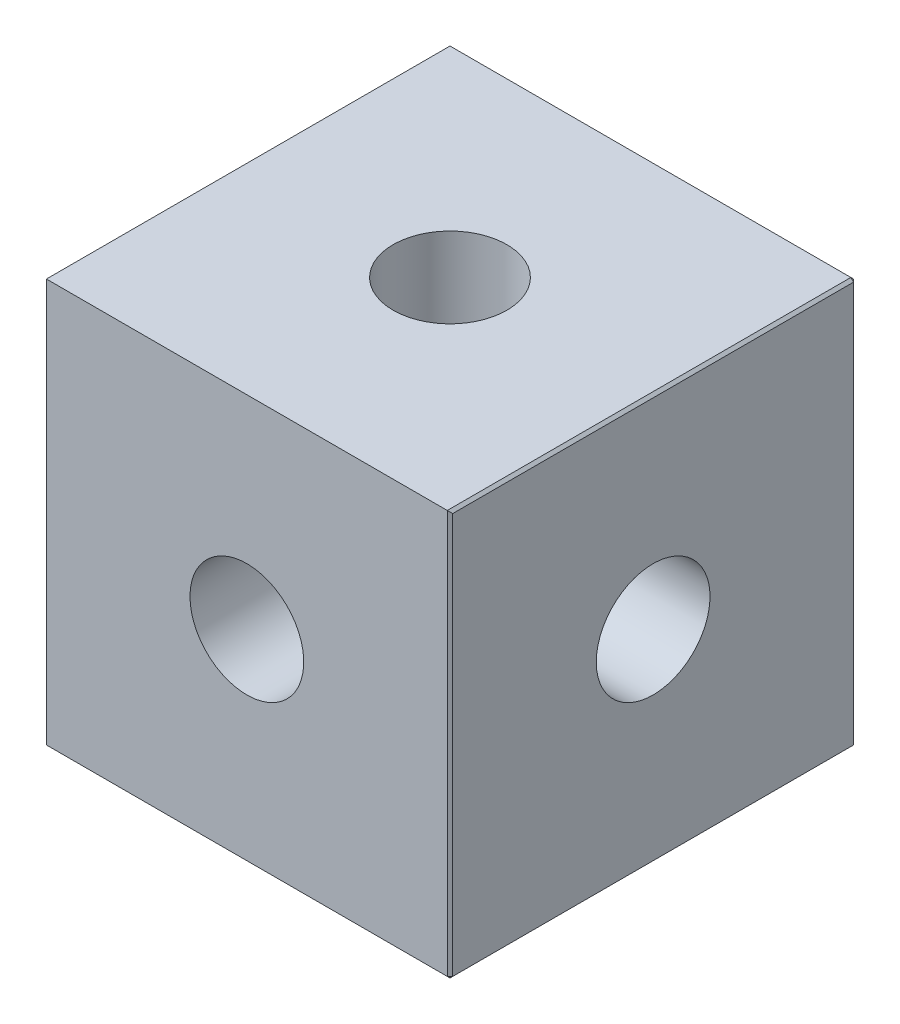
ISO-10303-21;
HEADER;
FILE_DESCRIPTION(('STEP AP214'),'2;1');
FILE_NAME('part.step','',(''),(''),'','','');
FILE_SCHEMA(('AUTOMOTIVE_DESIGN { 1 0 10303 214 1 1 1 1 }'));
ENDSEC;
DATA;
#1=APPLICATION_CONTEXT('core data for automotive mechanical design processes');
#2=APPLICATION_PROTOCOL_DEFINITION('international standard','automotive_design',2000,#1);
#3=PRODUCT_CONTEXT('',#1,'mechanical');
#4=PRODUCT('Part','Part','',(#3));
#5=PRODUCT_RELATED_PRODUCT_CATEGORY('part','',(#4));
#6=PRODUCT_DEFINITION_FORMATION('','',#4);
#7=PRODUCT_DEFINITION_CONTEXT('part definition',#1,'design');
#8=PRODUCT_DEFINITION('design','',#6,#7);
#9=PRODUCT_DEFINITION_SHAPE('','',#8);
#10=(LENGTH_UNIT() NAMED_UNIT(*) SI_UNIT(.MILLI.,.METRE.));
#11=(NAMED_UNIT(*) PLANE_ANGLE_UNIT() SI_UNIT($,.RADIAN.));
#12=(NAMED_UNIT(*) SI_UNIT($,.STERADIAN.) SOLID_ANGLE_UNIT());
#13=UNCERTAINTY_MEASURE_WITH_UNIT(LENGTH_MEASURE(1.E-05),#10,'distance_accuracy_value','');
#14=(GEOMETRIC_REPRESENTATION_CONTEXT(3) GLOBAL_UNCERTAINTY_ASSIGNED_CONTEXT((#13)) GLOBAL_UNIT_ASSIGNED_CONTEXT((#10,
#11,#12)) REPRESENTATION_CONTEXT('',''));
#15=CARTESIAN_POINT('',(0.,0.,0.));
#16=DIRECTION('',(0.,0.,1.));
#17=DIRECTION('',(1.,0.,0.));
#18=AXIS2_PLACEMENT_3D('',#15,#16,#17);
#19=CARTESIAN_POINT('',(-7.5,15.,-7.5));
#20=DIRECTION('',(1.,0.,0.));
#21=DIRECTION('',(0.,0.,-1.));
#22=AXIS2_PLACEMENT_3D('',#19,#20,#21);
#23=PLANE('',#22);
#24=DIRECTION('',(0.,-1.,0.));
#25=VECTOR('',#24,1.);
#26=CARTESIAN_POINT('',(-7.5,15.,-7.4));
#27=LINE('',#26,#25);
#28=CARTESIAN_POINT('',(-7.5,14.9,-7.4));
#29=VERTEX_POINT('',#28);
#30=CARTESIAN_POINT('',(-7.5,0.0999999999999994,-7.4));
#31=VERTEX_POINT('',#30);
#32=EDGE_CURVE('E254',#29,#31,#27,.T.);
#33=ORIENTED_EDGE('',*,*,#32,.T.);
#34=DIRECTION('',(0.,0.,1.));
#35=VECTOR('',#34,1.);
#36=CARTESIAN_POINT('',(-7.5,0.0999999999999994,-7.5));
#37=LINE('',#36,#35);
#38=CARTESIAN_POINT('',(-7.5,0.0999999999999994,7.4));
#39=VERTEX_POINT('',#38);
#40=EDGE_CURVE('E11',#31,#39,#37,.T.);
#41=ORIENTED_EDGE('',*,*,#40,.T.);
#42=DIRECTION('',(0.,1.,0.));
#43=VECTOR('',#42,1.);
#44=CARTESIAN_POINT('',(-7.5,15.,7.4));
#45=LINE('',#44,#43);
#46=CARTESIAN_POINT('',(-7.5,14.9,7.4));
#47=VERTEX_POINT('',#46);
#48=EDGE_CURVE('E65',#39,#47,#45,.T.);
#49=ORIENTED_EDGE('',*,*,#48,.T.);
#50=DIRECTION('',(0.,0.,-1.));
#51=VECTOR('',#50,1.);
#52=CARTESIAN_POINT('',(-7.5,14.9,-7.5));
#53=LINE('',#52,#51);
#54=EDGE_CURVE('E256',#47,#29,#53,.T.);
#55=ORIENTED_EDGE('',*,*,#54,.T.);
#56=EDGE_LOOP('',(#33,#41,#49,#55));
#57=FACE_BOUND('',#56,.T.);
#58=CARTESIAN_POINT('',(-7.5,7.5,0.));
#59=DIRECTION('',(-1.,0.,0.));
#60=DIRECTION('',(0.,0.,1.));
#61=AXIS2_PLACEMENT_3D('',#58,#59,#60);
#62=CIRCLE('',#61,2.1);
#63=CARTESIAN_POINT('',(-7.5,7.5,2.1));
#64=VERTEX_POINT('',#63);
#65=EDGE_CURVE('E308',#64,#64,#62,.T.);
#66=ORIENTED_EDGE('',*,*,#65,.F.);
#67=EDGE_LOOP('',(#66));
#68=FACE_BOUND('',#67,.T.);
#69=ADVANCED_FACE('F55',(#57,#68),#23,.F.);
#70=CARTESIAN_POINT('',(0.,15.,0.));
#71=DIRECTION('',(0.,1.,0.));
#72=DIRECTION('',(0.,0.,1.));
#73=AXIS2_PLACEMENT_3D('',#70,#71,#72);
#74=CYLINDRICAL_SURFACE('',#73,2.1);
#75=CARTESIAN_POINT('',(0.,15.,0.));
#76=DIRECTION('',(0.,1.,0.));
#77=DIRECTION('',(0.,0.,1.));
#78=AXIS2_PLACEMENT_3D('',#75,#76,#77);
#79=CIRCLE('',#78,2.1);
#80=CARTESIAN_POINT('',(0.,15.,2.1));
#81=VERTEX_POINT('',#80);
#82=EDGE_CURVE('E346',#81,#81,#79,.T.);
#83=ORIENTED_EDGE('',*,*,#82,.T.);
#84=EDGE_LOOP('',(#83));
#85=FACE_BOUND('',#84,.T.);
#86=CARTESIAN_POINT('',(0.,7.5,0.));
#87=DIRECTION('',(0.,0.707106781186547,0.707106781186547));
#88=DIRECTION('',(0.,0.707106781186547,-0.707106781186547));
#89=AXIS2_PLACEMENT_3D('',#86,#87,#88);
#90=ELLIPSE('',#89,2.9698484809835,2.1);
#91=CARTESIAN_POINT('',(-1.48492424049175,8.98492424049175,-1.48492424049175));
#92=VERTEX_POINT('',#91);
#93=CARTESIAN_POINT('',(1.48492424049175,8.98492424049175,-1.48492424049175));
#94=VERTEX_POINT('',#93);
#95=EDGE_CURVE('E185',#92,#94,#90,.F.);
#96=ORIENTED_EDGE('',*,*,#95,.T.);
#97=CARTESIAN_POINT('',(0.,7.5,0.));
#98=DIRECTION('',(-0.707106781186547,0.707106781186547,0.));
#99=DIRECTION('',(0.707106781186547,0.707106781186547,0.));
#100=AXIS2_PLACEMENT_3D('',#97,#98,#99);
#101=ELLIPSE('',#100,2.9698484809835,2.1);
#102=CARTESIAN_POINT('',(1.48492424049175,8.98492424049175,1.48492424049175));
#103=VERTEX_POINT('',#102);
#104=EDGE_CURVE('E336',#94,#103,#101,.F.);
#105=ORIENTED_EDGE('',*,*,#104,.T.);
#106=CARTESIAN_POINT('',(0.,7.5,0.));
#107=DIRECTION('',(0.,0.707106781186547,-0.707106781186547));
#108=DIRECTION('',(0.,0.707106781186547,0.707106781186547));
#109=AXIS2_PLACEMENT_3D('',#106,#107,#108);
#110=ELLIPSE('',#109,2.9698484809835,2.1);
#111=CARTESIAN_POINT('',(-1.48492424049175,8.98492424049175,1.48492424049175));
#112=VERTEX_POINT('',#111);
#113=EDGE_CURVE('E178',#103,#112,#110,.F.);
#114=ORIENTED_EDGE('',*,*,#113,.T.);
#115=CARTESIAN_POINT('',(0.,7.5,0.));
#116=DIRECTION('',(0.707106781186547,0.707106781186547,0.));
#117=DIRECTION('',(-0.707106781186547,0.707106781186547,0.));
#118=AXIS2_PLACEMENT_3D('',#115,#116,#117);
#119=ELLIPSE('',#118,2.9698484809835,2.1);
#120=EDGE_CURVE('E168',#112,#92,#119,.F.);
#121=ORIENTED_EDGE('',*,*,#120,.T.);
#122=EDGE_LOOP('',(#96,#105,#114,#121));
#123=FACE_BOUND('',#122,.T.);
#124=ADVANCED_FACE('F183',(#85,#123),#74,.F.);
#125=CARTESIAN_POINT('',(7.5,15.,-7.5));
#126=DIRECTION('',(-1.,0.,0.));
#127=DIRECTION('',(0.,0.,1.));
#128=AXIS2_PLACEMENT_3D('',#125,#126,#127);
#129=PLANE('',#128);
#130=DIRECTION('',(0.,1.,0.));
#131=VECTOR('',#130,1.);
#132=CARTESIAN_POINT('',(7.5,15.,-7.4));
#133=LINE('',#132,#131);
#134=CARTESIAN_POINT('',(7.5,0.0999999999999994,-7.4));
#135=VERTEX_POINT('',#134);
#136=CARTESIAN_POINT('',(7.5,14.9,-7.4));
#137=VERTEX_POINT('',#136);
#138=EDGE_CURVE('E225',#135,#137,#133,.T.);
#139=ORIENTED_EDGE('',*,*,#138,.T.);
#140=DIRECTION('',(0.,0.,1.));
#141=VECTOR('',#140,1.);
#142=CARTESIAN_POINT('',(7.5,14.9,7.5));
#143=LINE('',#142,#141);
#144=CARTESIAN_POINT('',(7.5,14.9,7.4));
#145=VERTEX_POINT('',#144);
#146=EDGE_CURVE('E227',#137,#145,#143,.T.);
#147=ORIENTED_EDGE('',*,*,#146,.T.);
#148=DIRECTION('',(0.,-1.,0.));
#149=VECTOR('',#148,1.);
#150=CARTESIAN_POINT('',(7.5,15.,7.4));
#151=LINE('',#150,#149);
#152=CARTESIAN_POINT('',(7.5,0.0999999999999994,7.4));
#153=VERTEX_POINT('',#152);
#154=EDGE_CURVE('E221',#145,#153,#151,.T.);
#155=ORIENTED_EDGE('',*,*,#154,.T.);
#156=DIRECTION('',(0.,0.,-1.));
#157=VECTOR('',#156,1.);
#158=CARTESIAN_POINT('',(7.5,0.0999999999999994,-7.5));
#159=LINE('',#158,#157);
#160=EDGE_CURVE('E223',#153,#135,#159,.T.);
#161=ORIENTED_EDGE('',*,*,#160,.T.);
#162=EDGE_LOOP('',(#139,#147,#155,#161));
#163=FACE_BOUND('',#162,.T.);
#164=CARTESIAN_POINT('',(7.5,7.5,0.));
#165=DIRECTION('',(-1.,0.,0.));
#166=DIRECTION('',(0.,0.,1.));
#167=AXIS2_PLACEMENT_3D('',#164,#165,#166);
#168=CIRCLE('',#167,2.1);
#169=CARTESIAN_POINT('',(7.5,7.5,2.1));
#170=VERTEX_POINT('',#169);
#171=EDGE_CURVE('E188',#170,#170,#168,.T.);
#172=ORIENTED_EDGE('',*,*,#171,.T.);
#173=EDGE_LOOP('',(#172));
#174=FACE_BOUND('',#173,.T.);
#175=ADVANCED_FACE('F371',(#163,#174),#129,.F.);
#176=CARTESIAN_POINT('',(-7.5,15.,-7.5));
#177=DIRECTION('',(0.,0.,1.));
#178=DIRECTION('',(1.,0.,0.));
#179=AXIS2_PLACEMENT_3D('',#176,#177,#178);
#180=PLANE('',#179);
#181=DIRECTION('',(0.,1.,0.));
#182=VECTOR('',#181,1.);
#183=CARTESIAN_POINT('',(-7.40000000000001,15.,-7.5));
#184=LINE('',#183,#182);
#185=CARTESIAN_POINT('',(-7.40000000000001,0.0999999999999959,-7.5));
#186=VERTEX_POINT('',#185);
#187=CARTESIAN_POINT('',(-7.40000000000001,14.9,-7.5));
#188=VERTEX_POINT('',#187);
#189=EDGE_CURVE('E230',#186,#188,#184,.T.);
#190=ORIENTED_EDGE('',*,*,#189,.T.);
#191=DIRECTION('',(1.,0.,0.));
#192=VECTOR('',#191,1.);
#193=CARTESIAN_POINT('',(7.5,14.9,-7.5));
#194=LINE('',#193,#192);
#195=CARTESIAN_POINT('',(7.4,14.9,-7.5));
#196=VERTEX_POINT('',#195);
#197=EDGE_CURVE('E236',#188,#196,#194,.T.);
#198=ORIENTED_EDGE('',*,*,#197,.T.);
#199=DIRECTION('',(0.,-1.,0.));
#200=VECTOR('',#199,1.);
#201=CARTESIAN_POINT('',(7.4,15.,-7.5));
#202=LINE('',#201,#200);
#203=CARTESIAN_POINT('',(7.4,0.0999999999999959,-7.5));
#204=VERTEX_POINT('',#203);
#205=EDGE_CURVE('E234',#196,#204,#202,.T.);
#206=ORIENTED_EDGE('',*,*,#205,.T.);
#207=DIRECTION('',(-1.,0.,0.));
#208=VECTOR('',#207,1.);
#209=CARTESIAN_POINT('',(-7.5,0.0999999999999959,-7.5));
#210=LINE('',#209,#208);
#211=EDGE_CURVE('E232',#204,#186,#210,.T.);
#212=ORIENTED_EDGE('',*,*,#211,.T.);
#213=EDGE_LOOP('',(#190,#198,#206,#212));
#214=FACE_BOUND('',#213,.T.);
#215=CARTESIAN_POINT('',(0.,7.5,-7.5));
#216=DIRECTION('',(0.,0.,-1.));
#217=DIRECTION('',(-1.,0.,0.));
#218=AXIS2_PLACEMENT_3D('',#215,#216,#217);
#219=CIRCLE('',#218,2.1);
#220=CARTESIAN_POINT('',(-2.1,7.5,-7.5));
#221=VERTEX_POINT('',#220);
#222=EDGE_CURVE('E338',#221,#221,#219,.T.);
#223=ORIENTED_EDGE('',*,*,#222,.F.);
#224=EDGE_LOOP('',(#223));
#225=FACE_BOUND('',#224,.T.);
#226=ADVANCED_FACE('F382',(#214,#225),#180,.F.);
#227=CARTESIAN_POINT('',(-7.5,15.,7.5));
#228=DIRECTION('',(0.,0.,-1.));
#229=DIRECTION('',(-1.,0.,0.));
#230=AXIS2_PLACEMENT_3D('',#227,#228,#229);
#231=PLANE('',#230);
#232=CARTESIAN_POINT('',(0.,7.5,7.5));
#233=DIRECTION('',(0.,0.,-1.));
#234=DIRECTION('',(-1.,0.,0.));
#235=AXIS2_PLACEMENT_3D('',#232,#233,#234);
#236=CIRCLE('',#235,2.1);
#237=CARTESIAN_POINT('',(-2.1,7.5,7.5));
#238=VERTEX_POINT('',#237);
#239=EDGE_CURVE('E342',#238,#238,#236,.T.);
#240=ORIENTED_EDGE('',*,*,#239,.T.);
#241=EDGE_LOOP('',(#240));
#242=FACE_BOUND('',#241,.T.);
#243=DIRECTION('',(1.,0.,0.));
#244=VECTOR('',#243,1.);
#245=CARTESIAN_POINT('',(-7.5,0.0999999999999994,7.5));
#246=LINE('',#245,#244);
#247=CARTESIAN_POINT('',(-7.4,0.0999999999999994,7.5));
#248=VERTEX_POINT('',#247);
#249=CARTESIAN_POINT('',(7.4,0.0999999999999994,7.5));
#250=VERTEX_POINT('',#249);
#251=EDGE_CURVE('E250',#248,#250,#246,.T.);
#252=ORIENTED_EDGE('',*,*,#251,.T.);
#253=DIRECTION('',(0.,1.,0.));
#254=VECTOR('',#253,1.);
#255=CARTESIAN_POINT('',(7.4,15.,7.5));
#256=LINE('',#255,#254);
#257=CARTESIAN_POINT('',(7.4,15.,7.5));
#258=VERTEX_POINT('',#257);
#259=EDGE_CURVE('E252',#250,#258,#256,.T.);
#260=ORIENTED_EDGE('',*,*,#259,.T.);
#261=DIRECTION('',(1.,0.,0.));
#262=VECTOR('',#261,1.);
#263=CARTESIAN_POINT('',(-7.5,15.,7.5));
#264=LINE('',#263,#262);
#265=CARTESIAN_POINT('',(-7.4,15.,7.5));
#266=VERTEX_POINT('',#265);
#267=EDGE_CURVE('E194',#266,#258,#264,.T.);
#268=ORIENTED_EDGE('',*,*,#267,.F.);
#269=DIRECTION('',(0.,-1.,0.));
#270=VECTOR('',#269,1.);
#271=CARTESIAN_POINT('',(-7.4,15.,7.5));
#272=LINE('',#271,#270);
#273=EDGE_CURVE('E248',#266,#248,#272,.T.);
#274=ORIENTED_EDGE('',*,*,#273,.T.);
#275=EDGE_LOOP('',(#252,#260,#268,#274));
#276=FACE_BOUND('',#275,.T.);
#277=ADVANCED_FACE('F381',(#242,#276),#231,.F.);
#278=CARTESIAN_POINT('',(0.,15.,0.));
#279=DIRECTION('',(0.,1.,0.));
#280=DIRECTION('',(0.,0.,1.));
#281=AXIS2_PLACEMENT_3D('',#278,#279,#280);
#282=PLANE('',#281);
#283=ORIENTED_EDGE('',*,*,#82,.F.);
#284=EDGE_LOOP('',(#283));
#285=FACE_BOUND('',#284,.T.);
#286=ORIENTED_EDGE('',*,*,#267,.T.);
#287=DIRECTION('',(0.,0.,-1.));
#288=VECTOR('',#287,1.);
#289=CARTESIAN_POINT('',(7.4,15.,-7.5));
#290=LINE('',#289,#288);
#291=CARTESIAN_POINT('',(7.4,15.,-7.4));
#292=VERTEX_POINT('',#291);
#293=EDGE_CURVE('E218',#258,#292,#290,.T.);
#294=ORIENTED_EDGE('',*,*,#293,.T.);
#295=DIRECTION('',(-1.,0.,0.));
#296=VECTOR('',#295,1.);
#297=CARTESIAN_POINT('',(-7.5,15.,-7.4));
#298=LINE('',#297,#296);
#299=CARTESIAN_POINT('',(-7.40000000000001,15.,-7.4));
#300=VERTEX_POINT('',#299);
#301=EDGE_CURVE('E216',#292,#300,#298,.T.);
#302=ORIENTED_EDGE('',*,*,#301,.T.);
#303=DIRECTION('',(0.,0.,1.));
#304=VECTOR('',#303,1.);
#305=CARTESIAN_POINT('',(-7.4,15.,7.5));
#306=LINE('',#305,#304);
#307=EDGE_CURVE('E214',#300,#266,#306,.T.);
#308=ORIENTED_EDGE('',*,*,#307,.T.);
#309=EDGE_LOOP('',(#286,#294,#302,#308));
#310=FACE_BOUND('',#309,.T.);
#311=ADVANCED_FACE('F367',(#285,#310),#282,.T.);
#312=CARTESIAN_POINT('',(0.,0.,0.));
#313=DIRECTION('',(0.,1.,0.));
#314=DIRECTION('',(0.,0.,1.));
#315=AXIS2_PLACEMENT_3D('',#312,#313,#314);
#316=PLANE('',#315);
#317=DIRECTION('',(0.,0.,-1.));
#318=VECTOR('',#317,1.);
#319=CARTESIAN_POINT('',(-7.40000000000001,0.,0.));
#320=LINE('',#319,#318);
#321=CARTESIAN_POINT('',(-7.4,0.,7.4));
#322=VERTEX_POINT('',#321);
#323=CARTESIAN_POINT('',(-7.40000000000001,0.,-7.4));
#324=VERTEX_POINT('',#323);
#325=EDGE_CURVE('E239',#322,#324,#320,.T.);
#326=ORIENTED_EDGE('',*,*,#325,.T.);
#327=DIRECTION('',(1.,0.,0.));
#328=VECTOR('',#327,1.);
#329=CARTESIAN_POINT('',(0.,0.,-7.4));
#330=LINE('',#329,#328);
#331=CARTESIAN_POINT('',(7.4,0.,-7.4));
#332=VERTEX_POINT('',#331);
#333=EDGE_CURVE('E245',#324,#332,#330,.T.);
#334=ORIENTED_EDGE('',*,*,#333,.T.);
#335=DIRECTION('',(0.,0.,1.));
#336=VECTOR('',#335,1.);
#337=CARTESIAN_POINT('',(7.4,0.,0.));
#338=LINE('',#337,#336);
#339=CARTESIAN_POINT('',(7.4,0.,7.4));
#340=VERTEX_POINT('',#339);
#341=EDGE_CURVE('E243',#332,#340,#338,.T.);
#342=ORIENTED_EDGE('',*,*,#341,.T.);
#343=DIRECTION('',(-1.,0.,0.));
#344=VECTOR('',#343,1.);
#345=CARTESIAN_POINT('',(0.,0.,7.4));
#346=LINE('',#345,#344);
#347=EDGE_CURVE('E241',#340,#322,#346,.T.);
#348=ORIENTED_EDGE('',*,*,#347,.T.);
#349=EDGE_LOOP('',(#326,#334,#342,#348));
#350=FACE_BOUND('',#349,.T.);
#351=CARTESIAN_POINT('',(0.,0.,0.));
#352=DIRECTION('',(0.,1.,0.));
#353=DIRECTION('',(0.,0.,1.));
#354=AXIS2_PLACEMENT_3D('',#351,#352,#353);
#355=CIRCLE('',#354,2.1);
#356=CARTESIAN_POINT('',(0.,0.,2.1));
#357=VERTEX_POINT('',#356);
#358=EDGE_CURVE('E204',#357,#357,#355,.T.);
#359=ORIENTED_EDGE('',*,*,#358,.T.);
#360=EDGE_LOOP('',(#359));
#361=FACE_BOUND('',#360,.T.);
#362=ADVANCED_FACE('F353',(#350,#361),#316,.F.);
#363=CARTESIAN_POINT('',(0.,7.5,0.));
#364=DIRECTION('',(0.,0.707106781186547,-0.707106781186547));
#365=DIRECTION('',(0.,0.707106781186547,0.707106781186547));
#366=AXIS2_PLACEMENT_3D('',#363,#364,#365);
#367=ELLIPSE('',#366,2.9698484809835,2.1);
#368=CARTESIAN_POINT('',(1.48492424049175,6.01507575950825,-1.48492424049175));
#369=VERTEX_POINT('',#368);
#370=CARTESIAN_POINT('',(-1.48492424049175,6.01507575950825,-1.48492424049175));
#371=VERTEX_POINT('',#370);
#372=EDGE_CURVE('E201',#369,#371,#367,.T.);
#373=ORIENTED_EDGE('',*,*,#372,.T.);
#374=CARTESIAN_POINT('',(0.,7.5,0.));
#375=DIRECTION('',(-0.707106781186547,0.707106781186547,0.));
#376=DIRECTION('',(0.707106781186547,0.707106781186547,0.));
#377=AXIS2_PLACEMENT_3D('',#374,#375,#376);
#378=ELLIPSE('',#377,2.9698484809835,2.1);
#379=CARTESIAN_POINT('',(-1.48492424049175,6.01507575950825,1.48492424049175));
#380=VERTEX_POINT('',#379);
#381=EDGE_CURVE('E171',#371,#380,#378,.T.);
#382=ORIENTED_EDGE('',*,*,#381,.T.);
#383=CARTESIAN_POINT('',(0.,7.5,0.));
#384=DIRECTION('',(0.,0.707106781186547,0.707106781186547));
#385=DIRECTION('',(0.,0.707106781186547,-0.707106781186547));
#386=AXIS2_PLACEMENT_3D('',#383,#384,#385);
#387=ELLIPSE('',#386,2.9698484809835,2.1);
#388=CARTESIAN_POINT('',(1.48492424049175,6.01507575950825,1.48492424049175));
#389=VERTEX_POINT('',#388);
#390=EDGE_CURVE('E193',#380,#389,#387,.T.);
#391=ORIENTED_EDGE('',*,*,#390,.T.);
#392=CARTESIAN_POINT('',(0.,7.5,0.));
#393=DIRECTION('',(0.707106781186547,0.707106781186547,0.));
#394=DIRECTION('',(-0.707106781186547,0.707106781186547,0.));
#395=AXIS2_PLACEMENT_3D('',#392,#393,#394);
#396=ELLIPSE('',#395,2.9698484809835,2.1);
#397=EDGE_CURVE('E332',#389,#369,#396,.T.);
#398=ORIENTED_EDGE('',*,*,#397,.T.);
#399=EDGE_LOOP('',(#373,#382,#391,#398));
#400=FACE_BOUND('',#399,.T.);
#401=ORIENTED_EDGE('',*,*,#358,.F.);
#402=EDGE_LOOP('',(#401));
#403=FACE_BOUND('',#402,.T.);
#404=ADVANCED_FACE('F355',(#400,#403),#74,.F.);
#405=CARTESIAN_POINT('',(0.,7.5,-7.5));
#406=DIRECTION('',(0.,0.,-1.));
#407=DIRECTION('',(-1.,0.,0.));
#408=AXIS2_PLACEMENT_3D('',#405,#406,#407);
#409=CYLINDRICAL_SURFACE('',#408,2.1);
#410=ORIENTED_EDGE('',*,*,#222,.T.);
#411=EDGE_LOOP('',(#410));
#412=FACE_BOUND('',#411,.T.);
#413=ORIENTED_EDGE('',*,*,#372,.F.);
#414=CARTESIAN_POINT('',(0.,7.5,0.));
#415=DIRECTION('',(-0.707106781186548,0.,-0.707106781186547));
#416=DIRECTION('',(0.707106781186547,0.,-0.707106781186548));
#417=AXIS2_PLACEMENT_3D('',#414,#415,#416);
#418=ELLIPSE('',#417,2.9698484809835,2.1);
#419=EDGE_CURVE('E177',#369,#94,#418,.F.);
#420=ORIENTED_EDGE('',*,*,#419,.T.);
#421=ORIENTED_EDGE('',*,*,#95,.F.);
#422=CARTESIAN_POINT('',(0.,7.5,0.));
#423=DIRECTION('',(0.707106781186547,0.,-0.707106781186548));
#424=DIRECTION('',(-0.707106781186548,0.,-0.707106781186547));
#425=AXIS2_PLACEMENT_3D('',#422,#423,#424);
#426=ELLIPSE('',#425,2.9698484809835,2.1);
#427=EDGE_CURVE('E165',#92,#371,#426,.F.);
#428=ORIENTED_EDGE('',*,*,#427,.T.);
#429=EDGE_LOOP('',(#413,#420,#421,#428));
#430=FACE_BOUND('',#429,.T.);
#431=ADVANCED_FACE('F191',(#412,#430),#409,.F.);
#432=ORIENTED_EDGE('',*,*,#239,.F.);
#433=EDGE_LOOP('',(#432));
#434=FACE_BOUND('',#433,.T.);
#435=ORIENTED_EDGE('',*,*,#390,.F.);
#436=CARTESIAN_POINT('',(0.,7.5,0.));
#437=DIRECTION('',(-0.707106781186548,0.,-0.707106781186547));
#438=DIRECTION('',(0.707106781186547,0.,-0.707106781186548));
#439=AXIS2_PLACEMENT_3D('',#436,#437,#438);
#440=ELLIPSE('',#439,2.9698484809835,2.1);
#441=EDGE_CURVE('E325',#380,#112,#440,.T.);
#442=ORIENTED_EDGE('',*,*,#441,.T.);
#443=ORIENTED_EDGE('',*,*,#113,.F.);
#444=CARTESIAN_POINT('',(0.,7.5,0.));
#445=DIRECTION('',(0.707106781186547,0.,-0.707106781186548));
#446=DIRECTION('',(-0.707106781186548,0.,-0.707106781186547));
#447=AXIS2_PLACEMENT_3D('',#444,#445,#446);
#448=ELLIPSE('',#447,2.9698484809835,2.1);
#449=EDGE_CURVE('E328',#103,#389,#448,.T.);
#450=ORIENTED_EDGE('',*,*,#449,.T.);
#451=EDGE_LOOP('',(#435,#442,#443,#450));
#452=FACE_BOUND('',#451,.T.);
#453=ADVANCED_FACE('F363',(#434,#452),#409,.F.);
#454=CARTESIAN_POINT('',(-7.5,7.5,0.));
#455=DIRECTION('',(-1.,0.,0.));
#456=DIRECTION('',(0.,0.,1.));
#457=AXIS2_PLACEMENT_3D('',#454,#455,#456);
#458=CYLINDRICAL_SURFACE('',#457,2.1);
#459=ORIENTED_EDGE('',*,*,#65,.T.);
#460=EDGE_LOOP('',(#459));
#461=FACE_BOUND('',#460,.T.);
#462=ORIENTED_EDGE('',*,*,#381,.F.);
#463=ORIENTED_EDGE('',*,*,#427,.F.);
#464=ORIENTED_EDGE('',*,*,#120,.F.);
#465=ORIENTED_EDGE('',*,*,#441,.F.);
#466=EDGE_LOOP('',(#462,#463,#464,#465));
#467=FACE_BOUND('',#466,.T.);
#468=ADVANCED_FACE('F167',(#461,#467),#458,.F.);
#469=ORIENTED_EDGE('',*,*,#171,.F.);
#470=EDGE_LOOP('',(#469));
#471=FACE_BOUND('',#470,.T.);
#472=ORIENTED_EDGE('',*,*,#397,.F.);
#473=ORIENTED_EDGE('',*,*,#449,.F.);
#474=ORIENTED_EDGE('',*,*,#104,.F.);
#475=ORIENTED_EDGE('',*,*,#419,.F.);
#476=EDGE_LOOP('',(#472,#473,#474,#475));
#477=FACE_BOUND('',#476,.T.);
#478=ADVANCED_FACE('F499',(#471,#477),#458,.F.);
#479=CARTESIAN_POINT('',(-7.5,0.0999999999999994,-7.5));
#480=DIRECTION('',(0.70710678118656,0.707106781186535,0.));
#481=DIRECTION('',(0.,0.,1.));
#482=AXIS2_PLACEMENT_3D('',#479,#480,#481);
#483=PLANE('',#482);
#484=DIRECTION('',(-0.707106781186535,0.70710678118656,0.));
#485=VECTOR('',#484,1.);
#486=CARTESIAN_POINT('',(-7.4,0.,7.4));
#487=LINE('',#486,#485);
#488=EDGE_CURVE('E306',#39,#322,#487,.F.);
#489=ORIENTED_EDGE('',*,*,#488,.F.);
#490=ORIENTED_EDGE('',*,*,#40,.F.);
#491=DIRECTION('',(0.707106781186535,-0.70710678118656,0.));
#492=VECTOR('',#491,1.);
#493=CARTESIAN_POINT('',(-7.45,0.0499999999999997,-7.4));
#494=LINE('',#493,#492);
#495=EDGE_CURVE('E60',#324,#31,#494,.F.);
#496=ORIENTED_EDGE('',*,*,#495,.F.);
#497=ORIENTED_EDGE('',*,*,#325,.F.);
#498=EDGE_LOOP('',(#489,#490,#496,#497));
#499=FACE_BOUND('',#498,.T.);
#500=ADVANCED_FACE('F58',(#499),#483,.F.);
#501=CARTESIAN_POINT('',(-7.4,15.,7.5));
#502=DIRECTION('',(0.707106781186563,0.,-0.707106781186532));
#503=DIRECTION('',(0.,-1.,0.));
#504=AXIS2_PLACEMENT_3D('',#501,#502,#503);
#505=PLANE('',#504);
#506=DIRECTION('',(-0.577350269189611,-0.577350269189631,-0.577350269189636));
#507=VECTOR('',#506,1.);
#508=CARTESIAN_POINT('',(-9.89999999999998,12.4999999999999,4.99999999999991));
#509=LINE('',#508,#507);
#510=EDGE_CURVE('E303',#47,#266,#509,.F.);
#511=ORIENTED_EDGE('',*,*,#510,.F.);
#512=ORIENTED_EDGE('',*,*,#48,.F.);
#513=DIRECTION('',(0.707106781186532,0.,0.707106781186563));
#514=VECTOR('',#513,1.);
#515=CARTESIAN_POINT('',(-7.45,0.0999999999999994,7.45));
#516=LINE('',#515,#514);
#517=EDGE_CURVE('E73',#248,#39,#516,.F.);
#518=ORIENTED_EDGE('',*,*,#517,.F.);
#519=ORIENTED_EDGE('',*,*,#273,.F.);
#520=EDGE_LOOP('',(#511,#512,#518,#519));
#521=FACE_BOUND('',#520,.T.);
#522=ADVANCED_FACE('F491',(#521),#505,.F.);
#523=CARTESIAN_POINT('',(-7.40000000000001,0.0999999999999959,-7.5));
#524=DIRECTION('',(-0.577350269189646,-0.577350269189626,-0.577350269189606));
#525=DIRECTION('',(0.707106781186535,-0.70710678118656,0.));
#526=AXIS2_PLACEMENT_3D('',#523,#524,#525);
#527=PLANE('',#526);
#528=DIRECTION('',(0.,0.707106781186535,-0.70710678118656));
#529=VECTOR('',#528,1.);
#530=CARTESIAN_POINT('',(-7.40000000000001,0.0999999999999959,-7.5));
#531=LINE('',#530,#529);
#532=EDGE_CURVE('E297',#324,#186,#531,.T.);
#533=ORIENTED_EDGE('',*,*,#532,.F.);
#534=ORIENTED_EDGE('',*,*,#495,.T.);
#535=DIRECTION('',(-0.707106781186535,0.,0.70710678118656));
#536=VECTOR('',#535,1.);
#537=CARTESIAN_POINT('',(-7.40000000000001,0.0999999999999959,-7.5));
#538=LINE('',#537,#536);
#539=EDGE_CURVE('E300',#186,#31,#538,.T.);
#540=ORIENTED_EDGE('',*,*,#539,.F.);
#541=EDGE_LOOP('',(#533,#534,#540));
#542=FACE_BOUND('',#541,.T.);
#543=ADVANCED_FACE('F486',(#542),#527,.T.);
#544=CARTESIAN_POINT('',(-7.4,0.,7.4));
#545=DIRECTION('',(-0.577350269189649,-0.577350269189604,0.577350269189624));
#546=DIRECTION('',(0.707106781186532,0.,0.707106781186563));
#547=AXIS2_PLACEMENT_3D('',#544,#545,#546);
#548=PLANE('',#547);
#549=ORIENTED_EDGE('',*,*,#517,.T.);
#550=ORIENTED_EDGE('',*,*,#488,.T.);
#551=DIRECTION('',(0.,-0.70710678118656,-0.707106781186535));
#552=VECTOR('',#551,1.);
#553=CARTESIAN_POINT('',(-7.4,0.,7.4));
#554=LINE('',#553,#552);
#555=EDGE_CURVE('E294',#248,#322,#554,.T.);
#556=ORIENTED_EDGE('',*,*,#555,.F.);
#557=EDGE_LOOP('',(#549,#550,#556));
#558=FACE_BOUND('',#557,.T.);
#559=ADVANCED_FACE('F479',(#558),#548,.T.);
#560=CARTESIAN_POINT('',(-7.40000000000001,15.,0.));
#561=DIRECTION('',(-0.70710678118656,0.707106781186535,0.));
#562=DIRECTION('',(0.,0.,-1.));
#563=AXIS2_PLACEMENT_3D('',#560,#561,#562);
#564=PLANE('',#563);
#565=ORIENTED_EDGE('',*,*,#510,.T.);
#566=ORIENTED_EDGE('',*,*,#307,.F.);
#567=DIRECTION('',(0.707106781186535,0.70710678118656,0.));
#568=VECTOR('',#567,1.);
#569=CARTESIAN_POINT('',(-7.40000000000001,15.,-7.4));
#570=LINE('',#569,#568);
#571=EDGE_CURVE('E291',#29,#300,#570,.T.);
#572=ORIENTED_EDGE('',*,*,#571,.F.);
#573=ORIENTED_EDGE('',*,*,#54,.F.);
#574=EDGE_LOOP('',(#565,#566,#572,#573));
#575=FACE_BOUND('',#574,.T.);
#576=ADVANCED_FACE('F472',(#575),#564,.T.);
#577=CARTESIAN_POINT('',(-7.5,15.,-7.4));
#578=DIRECTION('',(0.70710678118656,0.,0.707106781186535));
#579=DIRECTION('',(0.,-1.,0.));
#580=AXIS2_PLACEMENT_3D('',#577,#578,#579);
#581=PLANE('',#580);
#582=ORIENTED_EDGE('',*,*,#539,.T.);
#583=ORIENTED_EDGE('',*,*,#32,.F.);
#584=DIRECTION('',(0.707106781186535,0.,-0.70710678118656));
#585=VECTOR('',#584,1.);
#586=CARTESIAN_POINT('',(-7.45,14.9,-7.45));
#587=LINE('',#586,#585);
#588=EDGE_CURVE('E288',#188,#29,#587,.F.);
#589=ORIENTED_EDGE('',*,*,#588,.F.);
#590=ORIENTED_EDGE('',*,*,#189,.F.);
#591=EDGE_LOOP('',(#582,#583,#589,#590));
#592=FACE_BOUND('',#591,.T.);
#593=ADVANCED_FACE('F465',(#592),#581,.F.);
#594=CARTESIAN_POINT('',(-7.5,0.0999999999999959,-7.5));
#595=DIRECTION('',(0.,0.70710678118656,0.707106781186535));
#596=DIRECTION('',(-1.,0.,0.));
#597=AXIS2_PLACEMENT_3D('',#594,#595,#596);
#598=PLANE('',#597);
#599=ORIENTED_EDGE('',*,*,#532,.T.);
#600=ORIENTED_EDGE('',*,*,#211,.F.);
#601=DIRECTION('',(0.,-0.707106781186535,0.70710678118656));
#602=VECTOR('',#601,1.);
#603=CARTESIAN_POINT('',(7.4,0.0999999999999959,-7.5));
#604=LINE('',#603,#602);
#605=EDGE_CURVE('E285',#332,#204,#604,.F.);
#606=ORIENTED_EDGE('',*,*,#605,.F.);
#607=ORIENTED_EDGE('',*,*,#333,.F.);
#608=EDGE_LOOP('',(#599,#600,#606,#607));
#609=FACE_BOUND('',#608,.T.);
#610=ADVANCED_FACE('F458',(#609),#598,.F.);
#611=CARTESIAN_POINT('',(7.5,0.0999999999999994,-7.5));
#612=DIRECTION('',(-0.70710678118656,0.707106781186535,0.));
#613=DIRECTION('',(0.,0.,-1.));
#614=AXIS2_PLACEMENT_3D('',#611,#612,#613);
#615=PLANE('',#614);
#616=DIRECTION('',(-0.707106781186535,-0.70710678118656,0.));
#617=VECTOR('',#616,1.);
#618=CARTESIAN_POINT('',(7.4,0.,7.4));
#619=LINE('',#618,#617);
#620=EDGE_CURVE('E280',#340,#153,#619,.F.);
#621=ORIENTED_EDGE('',*,*,#620,.F.);
#622=ORIENTED_EDGE('',*,*,#341,.F.);
#623=DIRECTION('',(0.707106781186535,0.70710678118656,0.));
#624=VECTOR('',#623,1.);
#625=CARTESIAN_POINT('',(7.45,0.0499999999999993,-7.4));
#626=LINE('',#625,#624);
#627=EDGE_CURVE('E283',#135,#332,#626,.F.);
#628=ORIENTED_EDGE('',*,*,#627,.F.);
#629=ORIENTED_EDGE('',*,*,#160,.F.);
#630=EDGE_LOOP('',(#621,#622,#628,#629));
#631=FACE_BOUND('',#630,.T.);
#632=ADVANCED_FACE('F451',(#631),#615,.F.);
#633=CARTESIAN_POINT('',(-7.5,0.0999999999999994,7.5));
#634=DIRECTION('',(0.,0.707106781186535,-0.70710678118656));
#635=DIRECTION('',(1.,0.,0.));
#636=AXIS2_PLACEMENT_3D('',#633,#634,#635);
#637=PLANE('',#636);
#638=ORIENTED_EDGE('',*,*,#555,.T.);
#639=ORIENTED_EDGE('',*,*,#347,.F.);
#640=DIRECTION('',(0.,0.70710678118656,0.707106781186535));
#641=VECTOR('',#640,1.);
#642=CARTESIAN_POINT('',(7.4,0.,7.4));
#643=LINE('',#642,#641);
#644=EDGE_CURVE('E277',#250,#340,#643,.F.);
#645=ORIENTED_EDGE('',*,*,#644,.F.);
#646=ORIENTED_EDGE('',*,*,#251,.F.);
#647=EDGE_LOOP('',(#638,#639,#645,#646));
#648=FACE_BOUND('',#647,.T.);
#649=ADVANCED_FACE('F444',(#648),#637,.F.);
#650=CARTESIAN_POINT('',(-7.40000000000001,15.,-7.4));
#651=DIRECTION('',(-0.577350269189646,0.577350269189626,-0.577350269189606));
#652=DIRECTION('',(-0.707106781186535,-0.70710678118656,0.));
#653=AXIS2_PLACEMENT_3D('',#650,#651,#652);
#654=PLANE('',#653);
#655=ORIENTED_EDGE('',*,*,#588,.T.);
#656=ORIENTED_EDGE('',*,*,#571,.T.);
#657=DIRECTION('',(0.,-0.707106781186535,-0.70710678118656));
#658=VECTOR('',#657,1.);
#659=CARTESIAN_POINT('',(-7.40000000000001,15.,-7.4));
#660=LINE('',#659,#658);
#661=EDGE_CURVE('E274',#188,#300,#660,.F.);
#662=ORIENTED_EDGE('',*,*,#661,.F.);
#663=EDGE_LOOP('',(#655,#656,#662));
#664=FACE_BOUND('',#663,.T.);
#665=ADVANCED_FACE('F437',(#664),#654,.T.);
#666=CARTESIAN_POINT('',(7.4,0.0999999999999959,-7.5));
#667=DIRECTION('',(0.577350269189644,-0.577350269189624,-0.577350269189609));
#668=DIRECTION('',(0.707106781186535,0.70710678118656,0.));
#669=AXIS2_PLACEMENT_3D('',#666,#667,#668);
#670=PLANE('',#669);
#671=ORIENTED_EDGE('',*,*,#627,.T.);
#672=ORIENTED_EDGE('',*,*,#605,.T.);
#673=DIRECTION('',(-0.707106781186538,0.,-0.707106781186557));
#674=VECTOR('',#673,1.);
#675=CARTESIAN_POINT('',(7.4,0.0999999999999959,-7.5));
#676=LINE('',#675,#674);
#677=EDGE_CURVE('E271',#135,#204,#676,.T.);
#678=ORIENTED_EDGE('',*,*,#677,.F.);
#679=EDGE_LOOP('',(#671,#672,#678));
#680=FACE_BOUND('',#679,.T.);
#681=ADVANCED_FACE('F430',(#680),#670,.T.);
#682=CARTESIAN_POINT('',(7.4,0.,7.4));
#683=DIRECTION('',(0.577350269189651,-0.577350269189606,0.577350269189621));
#684=DIRECTION('',(0.707106781186529,0.,-0.707106781186566));
#685=AXIS2_PLACEMENT_3D('',#682,#683,#684);
#686=PLANE('',#685);
#687=ORIENTED_EDGE('',*,*,#644,.T.);
#688=ORIENTED_EDGE('',*,*,#620,.T.);
#689=DIRECTION('',(0.707106781186529,0.,-0.707106781186566));
#690=VECTOR('',#689,1.);
#691=CARTESIAN_POINT('',(7.45,0.0999999999999994,7.45));
#692=LINE('',#691,#690);
#693=EDGE_CURVE('E268',#250,#153,#692,.T.);
#694=ORIENTED_EDGE('',*,*,#693,.F.);
#695=EDGE_LOOP('',(#687,#688,#694));
#696=FACE_BOUND('',#695,.T.);
#697=ADVANCED_FACE('F423',(#696),#686,.T.);
#698=CARTESIAN_POINT('',(0.,15.,-7.4));
#699=DIRECTION('',(0.,0.70710678118656,-0.707106781186535));
#700=DIRECTION('',(1.,0.,0.));
#701=AXIS2_PLACEMENT_3D('',#698,#699,#700);
#702=PLANE('',#701);
#703=ORIENTED_EDGE('',*,*,#661,.T.);
#704=ORIENTED_EDGE('',*,*,#301,.F.);
#705=DIRECTION('',(0.,0.707106781186535,0.70710678118656));
#706=VECTOR('',#705,1.);
#707=CARTESIAN_POINT('',(7.4,15.,-7.4));
#708=LINE('',#707,#706);
#709=EDGE_CURVE('E265',#196,#292,#708,.T.);
#710=ORIENTED_EDGE('',*,*,#709,.F.);
#711=ORIENTED_EDGE('',*,*,#197,.F.);
#712=EDGE_LOOP('',(#703,#704,#710,#711));
#713=FACE_BOUND('',#712,.T.);
#714=ADVANCED_FACE('F416',(#713),#702,.T.);
#715=CARTESIAN_POINT('',(7.4,15.,-7.5));
#716=DIRECTION('',(-0.707106781186557,0.,0.707106781186538));
#717=DIRECTION('',(0.,-1.,0.));
#718=AXIS2_PLACEMENT_3D('',#715,#716,#717);
#719=PLANE('',#718);
#720=ORIENTED_EDGE('',*,*,#677,.T.);
#721=ORIENTED_EDGE('',*,*,#205,.F.);
#722=DIRECTION('',(0.707106781186538,0.,0.707106781186557));
#723=VECTOR('',#722,1.);
#724=CARTESIAN_POINT('',(7.45,14.9,-7.45));
#725=LINE('',#724,#723);
#726=EDGE_CURVE('E263',#137,#196,#725,.F.);
#727=ORIENTED_EDGE('',*,*,#726,.F.);
#728=ORIENTED_EDGE('',*,*,#138,.F.);
#729=EDGE_LOOP('',(#720,#721,#727,#728));
#730=FACE_BOUND('',#729,.T.);
#731=ADVANCED_FACE('F409',(#730),#719,.F.);
#732=CARTESIAN_POINT('',(7.5,15.,7.4));
#733=DIRECTION('',(-0.707106781186566,0.,-0.707106781186529));
#734=DIRECTION('',(0.,-1.,0.));
#735=AXIS2_PLACEMENT_3D('',#732,#733,#734);
#736=PLANE('',#735);
#737=ORIENTED_EDGE('',*,*,#693,.T.);
#738=ORIENTED_EDGE('',*,*,#154,.F.);
#739=DIRECTION('',(0.577350269189622,-0.577350269189602,-0.577350269189652));
#740=VECTOR('',#739,1.);
#741=CARTESIAN_POINT('',(7.46666666666667,14.9333333333333,7.43333333333333));
#742=LINE('',#741,#740);
#743=EDGE_CURVE('E261',#258,#145,#742,.T.);
#744=ORIENTED_EDGE('',*,*,#743,.F.);
#745=ORIENTED_EDGE('',*,*,#259,.F.);
#746=EDGE_LOOP('',(#737,#738,#744,#745));
#747=FACE_BOUND('',#746,.T.);
#748=ADVANCED_FACE('F402',(#747),#736,.F.);
#749=CARTESIAN_POINT('',(7.4,15.,-7.4));
#750=DIRECTION('',(0.577350269189624,0.577350269189644,-0.577350269189609));
#751=DIRECTION('',(-0.70710678118656,0.707106781186535,0.));
#752=AXIS2_PLACEMENT_3D('',#749,#750,#751);
#753=PLANE('',#752);
#754=ORIENTED_EDGE('',*,*,#726,.T.);
#755=ORIENTED_EDGE('',*,*,#709,.T.);
#756=DIRECTION('',(0.70710678118656,-0.707106781186535,0.));
#757=VECTOR('',#756,1.);
#758=CARTESIAN_POINT('',(7.4,15.,-7.4));
#759=LINE('',#758,#757);
#760=EDGE_CURVE('E259',#137,#292,#759,.F.);
#761=ORIENTED_EDGE('',*,*,#760,.F.);
#762=EDGE_LOOP('',(#754,#755,#761));
#763=FACE_BOUND('',#762,.T.);
#764=ADVANCED_FACE('F395',(#763),#753,.T.);
#765=CARTESIAN_POINT('',(7.4,15.,0.));
#766=DIRECTION('',(0.707106781186535,0.70710678118656,0.));
#767=DIRECTION('',(0.,0.,1.));
#768=AXIS2_PLACEMENT_3D('',#765,#766,#767);
#769=PLANE('',#768);
#770=ORIENTED_EDGE('',*,*,#743,.T.);
#771=ORIENTED_EDGE('',*,*,#146,.F.);
#772=ORIENTED_EDGE('',*,*,#760,.T.);
#773=ORIENTED_EDGE('',*,*,#293,.F.);
#774=EDGE_LOOP('',(#770,#771,#772,#773));
#775=FACE_BOUND('',#774,.T.);
#776=ADVANCED_FACE('F389',(#775),#769,.T.);
#777=CLOSED_SHELL('',(#69,#124,#175,#226,#277,#311,#362,#404,#431,#453,#468,#478,#500,#522,#543,
#559,#576,#593,#610,#632,#649,#665,#681,#697,#714,#731,#748,#764,#776));
#778=MANIFOLD_SOLID_BREP('B2',#777);
#779=ADVANCED_BREP_SHAPE_REPRESENTATION('',(#18,#778),#14);
#780=SHAPE_DEFINITION_REPRESENTATION(#9,#779);
ENDSEC;
END-ISO-10303-21;
